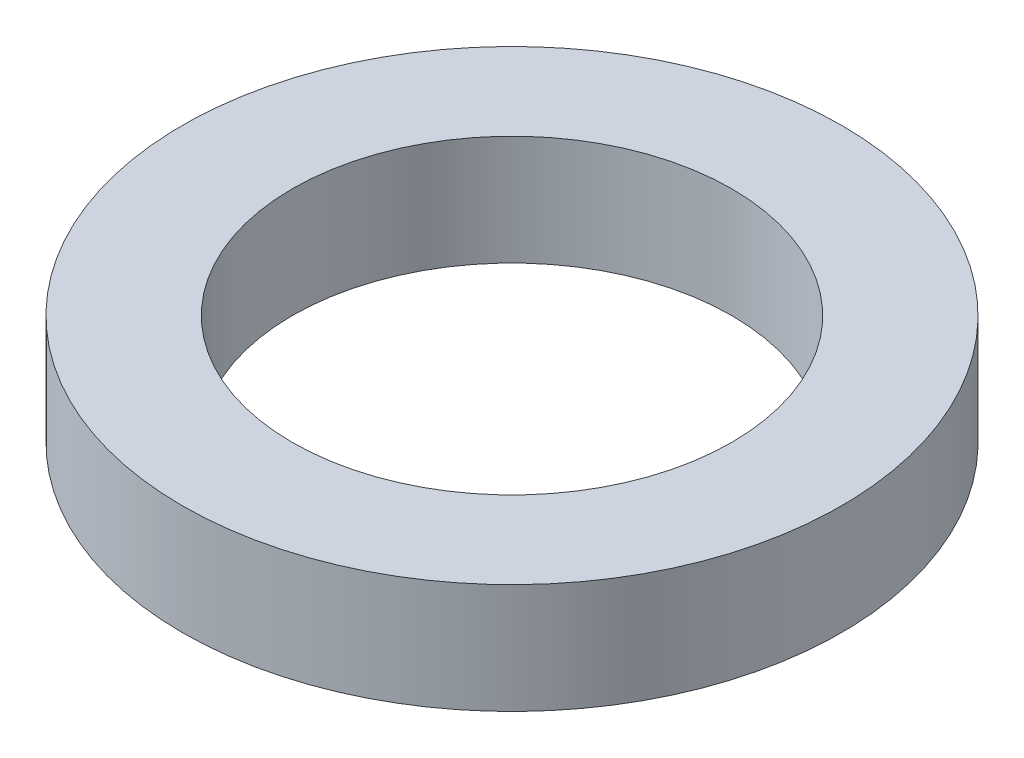
ISO-10303-21;
HEADER;
FILE_DESCRIPTION(('STEP AP214'),'2;1');
FILE_NAME('part.step','',(''),(''),'','','');
FILE_SCHEMA(('AUTOMOTIVE_DESIGN { 1 0 10303 214 1 1 1 1 }'));
ENDSEC;
DATA;
#1=APPLICATION_CONTEXT('core data for automotive mechanical design processes');
#2=APPLICATION_PROTOCOL_DEFINITION('international standard','automotive_design',2000,#1);
#3=PRODUCT_CONTEXT('',#1,'mechanical');
#4=PRODUCT('Part','Part','',(#3));
#5=PRODUCT_RELATED_PRODUCT_CATEGORY('part','',(#4));
#6=PRODUCT_DEFINITION_FORMATION('','',#4);
#7=PRODUCT_DEFINITION_CONTEXT('part definition',#1,'design');
#8=PRODUCT_DEFINITION('design','',#6,#7);
#9=PRODUCT_DEFINITION_SHAPE('','',#8);
#10=(LENGTH_UNIT() NAMED_UNIT(*) SI_UNIT(.MILLI.,.METRE.));
#11=(NAMED_UNIT(*) PLANE_ANGLE_UNIT() SI_UNIT($,.RADIAN.));
#12=(NAMED_UNIT(*) SI_UNIT($,.STERADIAN.) SOLID_ANGLE_UNIT());
#13=UNCERTAINTY_MEASURE_WITH_UNIT(LENGTH_MEASURE(1.E-05),#10,'distance_accuracy_value','');
#14=(GEOMETRIC_REPRESENTATION_CONTEXT(3) GLOBAL_UNCERTAINTY_ASSIGNED_CONTEXT((#13)) GLOBAL_UNIT_ASSIGNED_CONTEXT((#10,
#11,#12)) REPRESENTATION_CONTEXT('',''));
#15=CARTESIAN_POINT('',(0.,0.,0.));
#16=DIRECTION('',(0.,0.,1.));
#17=DIRECTION('',(1.,0.,0.));
#18=AXIS2_PLACEMENT_3D('',#15,#16,#17);
#19=CARTESIAN_POINT('',(0.,0.5,0.));
#20=DIRECTION('',(0.,1.,0.));
#21=DIRECTION('',(0.,0.,1.));
#22=AXIS2_PLACEMENT_3D('',#19,#20,#21);
#23=PLANE('',#22);
#24=CARTESIAN_POINT('',(0.,0.5,0.));
#25=DIRECTION('',(0.,1.,0.));
#26=DIRECTION('',(0.,0.,1.));
#27=AXIS2_PLACEMENT_3D('',#24,#25,#26);
#28=CIRCLE('',#27,1.5);
#29=CARTESIAN_POINT('',(0.,0.5,1.5));
#30=VERTEX_POINT('',#29);
#31=EDGE_CURVE('E10',#30,#30,#28,.T.);
#32=ORIENTED_EDGE('',*,*,#31,.T.);
#33=EDGE_LOOP('',(#32));
#34=FACE_BOUND('',#33,.T.);
#35=CARTESIAN_POINT('',(0.,0.5,0.));
#36=DIRECTION('',(0.,1.,0.));
#37=DIRECTION('',(0.,0.,1.));
#38=AXIS2_PLACEMENT_3D('',#35,#36,#37);
#39=CIRCLE('',#38,1.);
#40=CARTESIAN_POINT('',(0.,0.5,1.));
#41=VERTEX_POINT('',#40);
#42=EDGE_CURVE('E45',#41,#41,#39,.T.);
#43=ORIENTED_EDGE('',*,*,#42,.F.);
#44=EDGE_LOOP('',(#43));
#45=FACE_BOUND('',#44,.T.);
#46=ADVANCED_FACE('F34',(#34,#45),#23,.T.);
#47=CARTESIAN_POINT('',(0.,0.,0.));
#48=DIRECTION('',(0.,1.,0.));
#49=DIRECTION('',(0.,0.,1.));
#50=AXIS2_PLACEMENT_3D('',#47,#48,#49);
#51=PLANE('',#50);
#52=CARTESIAN_POINT('',(0.,0.,0.));
#53=DIRECTION('',(0.,1.,0.));
#54=DIRECTION('',(0.,0.,1.));
#55=AXIS2_PLACEMENT_3D('',#52,#53,#54);
#56=CIRCLE('',#55,1.5);
#57=CARTESIAN_POINT('',(0.,0.,1.5));
#58=VERTEX_POINT('',#57);
#59=EDGE_CURVE('E38',#58,#58,#56,.T.);
#60=ORIENTED_EDGE('',*,*,#59,.F.);
#61=EDGE_LOOP('',(#60));
#62=FACE_BOUND('',#61,.T.);
#63=CARTESIAN_POINT('',(0.,0.,0.));
#64=DIRECTION('',(0.,1.,0.));
#65=DIRECTION('',(0.,0.,1.));
#66=AXIS2_PLACEMENT_3D('',#63,#64,#65);
#67=CIRCLE('',#66,1.);
#68=CARTESIAN_POINT('',(0.,0.,1.));
#69=VERTEX_POINT('',#68);
#70=EDGE_CURVE('E47',#69,#69,#67,.T.);
#71=ORIENTED_EDGE('',*,*,#70,.T.);
#72=EDGE_LOOP('',(#71));
#73=FACE_BOUND('',#72,.T.);
#74=ADVANCED_FACE('F57',(#62,#73),#51,.F.);
#75=CARTESIAN_POINT('',(0.,0.5,0.));
#76=DIRECTION('',(0.,-1.,0.));
#77=DIRECTION('',(0.,0.,-1.));
#78=AXIS2_PLACEMENT_3D('',#75,#76,#77);
#79=CYLINDRICAL_SURFACE('',#78,1.5);
#80=ORIENTED_EDGE('',*,*,#31,.F.);
#81=EDGE_LOOP('',(#80));
#82=FACE_BOUND('',#81,.T.);
#83=ORIENTED_EDGE('',*,*,#59,.T.);
#84=EDGE_LOOP('',(#83));
#85=FACE_BOUND('',#84,.T.);
#86=ADVANCED_FACE('F36',(#82,#85),#79,.T.);
#87=CARTESIAN_POINT('',(0.,0.5,0.));
#88=DIRECTION('',(0.,-1.,0.));
#89=DIRECTION('',(0.,0.,-1.));
#90=AXIS2_PLACEMENT_3D('',#87,#88,#89);
#91=CYLINDRICAL_SURFACE('',#90,1.);
#92=ORIENTED_EDGE('',*,*,#42,.T.);
#93=EDGE_LOOP('',(#92));
#94=FACE_BOUND('',#93,.T.);
#95=ORIENTED_EDGE('',*,*,#70,.F.);
#96=EDGE_LOOP('',(#95));
#97=FACE_BOUND('',#96,.T.);
#98=ADVANCED_FACE('F53',(#94,#97),#91,.F.);
#99=CLOSED_SHELL('',(#46,#74,#86,#98));
#100=MANIFOLD_SOLID_BREP('B2',#99);
#101=ADVANCED_BREP_SHAPE_REPRESENTATION('',(#18,#100),#14);
#102=SHAPE_DEFINITION_REPRESENTATION(#9,#101);
ENDSEC;
END-ISO-10303-21;
